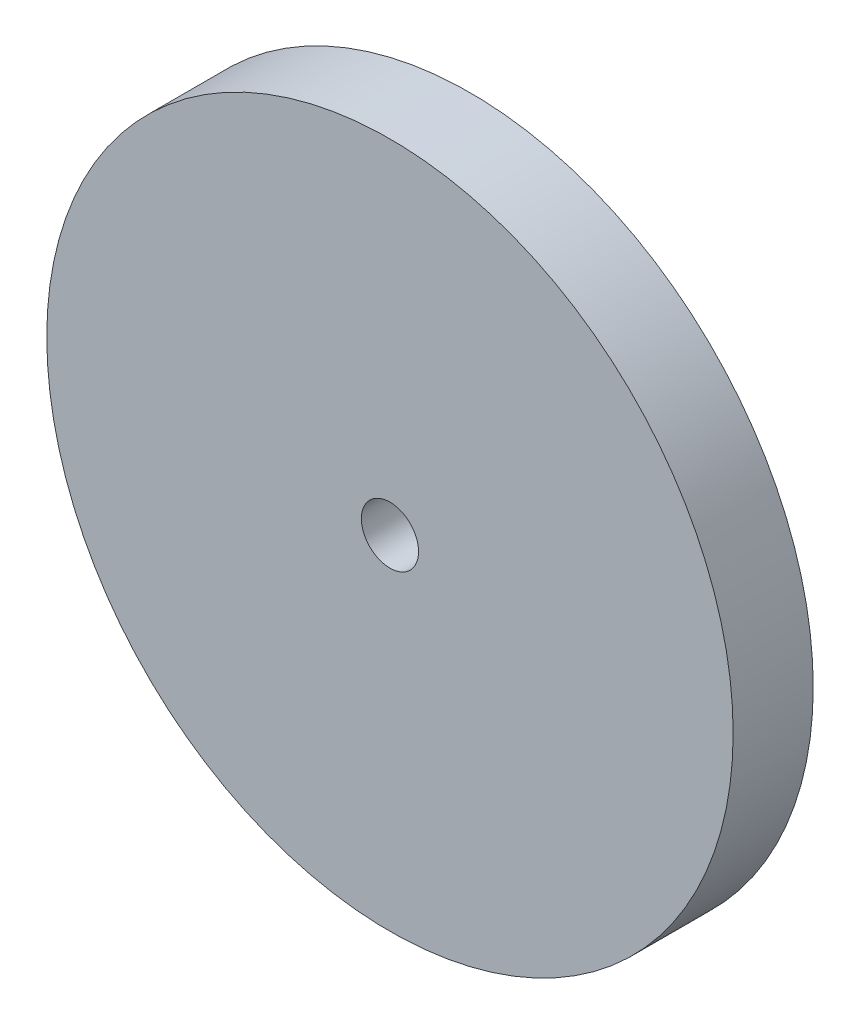
ISO-10303-21;
HEADER;
FILE_DESCRIPTION(('STEP AP214'),'2;1');
FILE_NAME('part.step','',(''),(''),'','','');
FILE_SCHEMA(('AUTOMOTIVE_DESIGN { 1 0 10303 214 1 1 1 1 }'));
ENDSEC;
DATA;
#1=APPLICATION_CONTEXT('core data for automotive mechanical design processes');
#2=APPLICATION_PROTOCOL_DEFINITION('international standard','automotive_design',2000,#1);
#3=PRODUCT_CONTEXT('',#1,'mechanical');
#4=PRODUCT('Part','Part','',(#3));
#5=PRODUCT_RELATED_PRODUCT_CATEGORY('part','',(#4));
#6=PRODUCT_DEFINITION_FORMATION('','',#4);
#7=PRODUCT_DEFINITION_CONTEXT('part definition',#1,'design');
#8=PRODUCT_DEFINITION('design','',#6,#7);
#9=PRODUCT_DEFINITION_SHAPE('','',#8);
#10=(LENGTH_UNIT() NAMED_UNIT(*) SI_UNIT(.MILLI.,.METRE.));
#11=(NAMED_UNIT(*) PLANE_ANGLE_UNIT() SI_UNIT($,.RADIAN.));
#12=(NAMED_UNIT(*) SI_UNIT($,.STERADIAN.) SOLID_ANGLE_UNIT());
#13=UNCERTAINTY_MEASURE_WITH_UNIT(LENGTH_MEASURE(1.E-05),#10,'distance_accuracy_value','');
#14=(GEOMETRIC_REPRESENTATION_CONTEXT(3) GLOBAL_UNCERTAINTY_ASSIGNED_CONTEXT((#13)) GLOBAL_UNIT_ASSIGNED_CONTEXT((#10,
#11,#12)) REPRESENTATION_CONTEXT('',''));
#15=CARTESIAN_POINT('',(0.,0.,0.));
#16=DIRECTION('',(0.,0.,1.));
#17=DIRECTION('',(1.,0.,0.));
#18=AXIS2_PLACEMENT_3D('',#15,#16,#17);
#19=CARTESIAN_POINT('',(0.,0.,-7.));
#20=DIRECTION('',(0.,0.,1.));
#21=DIRECTION('',(1.,0.,0.));
#22=AXIS2_PLACEMENT_3D('',#19,#20,#21);
#23=CYLINDRICAL_SURFACE('',#22,30.);
#24=CARTESIAN_POINT('',(0.,0.,-7.));
#25=DIRECTION('',(0.,0.,1.));
#26=DIRECTION('',(1.,0.,0.));
#27=AXIS2_PLACEMENT_3D('',#24,#25,#26);
#28=CIRCLE('',#27,30.);
#29=CARTESIAN_POINT('',(30.,0.,-7.));
#30=VERTEX_POINT('',#29);
#31=EDGE_CURVE('E10',#30,#30,#28,.T.);
#32=ORIENTED_EDGE('',*,*,#31,.T.);
#33=EDGE_LOOP('',(#32));
#34=FACE_BOUND('',#33,.T.);
#35=CARTESIAN_POINT('',(0.,0.,0.));
#36=DIRECTION('',(0.,0.,1.));
#37=DIRECTION('',(1.,0.,0.));
#38=AXIS2_PLACEMENT_3D('',#35,#36,#37);
#39=CIRCLE('',#38,30.);
#40=CARTESIAN_POINT('',(30.,0.,0.));
#41=VERTEX_POINT('',#40);
#42=EDGE_CURVE('E36',#41,#41,#39,.T.);
#43=ORIENTED_EDGE('',*,*,#42,.F.);
#44=EDGE_LOOP('',(#43));
#45=FACE_BOUND('',#44,.T.);
#46=ADVANCED_FACE('F33',(#34,#45),#23,.T.);
#47=CARTESIAN_POINT('',(0.,0.,-7.));
#48=DIRECTION('',(0.,0.,1.));
#49=DIRECTION('',(1.,0.,0.));
#50=AXIS2_PLACEMENT_3D('',#47,#48,#49);
#51=PLANE('',#50);
#52=CARTESIAN_POINT('',(0.,0.,-7.));
#53=DIRECTION('',(0.,0.,1.));
#54=DIRECTION('',(1.,0.,0.));
#55=AXIS2_PLACEMENT_3D('',#52,#53,#54);
#56=CIRCLE('',#55,2.5);
#57=CARTESIAN_POINT('',(2.5,0.,-7.));
#58=VERTEX_POINT('',#57);
#59=EDGE_CURVE('E43',#58,#58,#56,.T.);
#60=ORIENTED_EDGE('',*,*,#59,.T.);
#61=EDGE_LOOP('',(#60));
#62=FACE_BOUND('',#61,.T.);
#63=ORIENTED_EDGE('',*,*,#31,.F.);
#64=EDGE_LOOP('',(#63));
#65=FACE_BOUND('',#64,.T.);
#66=ADVANCED_FACE('F51',(#62,#65),#51,.F.);
#67=CARTESIAN_POINT('',(0.,0.,0.));
#68=DIRECTION('',(0.,0.,1.));
#69=DIRECTION('',(1.,0.,0.));
#70=AXIS2_PLACEMENT_3D('',#67,#68,#69);
#71=PLANE('',#70);
#72=CARTESIAN_POINT('',(0.,0.,0.));
#73=DIRECTION('',(0.,0.,1.));
#74=DIRECTION('',(1.,0.,0.));
#75=AXIS2_PLACEMENT_3D('',#72,#73,#74);
#76=CIRCLE('',#75,2.5);
#77=CARTESIAN_POINT('',(2.5,0.,0.));
#78=VERTEX_POINT('',#77);
#79=EDGE_CURVE('E45',#78,#78,#76,.T.);
#80=ORIENTED_EDGE('',*,*,#79,.F.);
#81=EDGE_LOOP('',(#80));
#82=FACE_BOUND('',#81,.T.);
#83=ORIENTED_EDGE('',*,*,#42,.T.);
#84=EDGE_LOOP('',(#83));
#85=FACE_BOUND('',#84,.T.);
#86=ADVANCED_FACE('F57',(#82,#85),#71,.T.);
#87=CARTESIAN_POINT('',(0.,0.,-7.));
#88=DIRECTION('',(0.,0.,1.));
#89=DIRECTION('',(1.,0.,0.));
#90=AXIS2_PLACEMENT_3D('',#87,#88,#89);
#91=CYLINDRICAL_SURFACE('',#90,2.5);
#92=ORIENTED_EDGE('',*,*,#59,.F.);
#93=EDGE_LOOP('',(#92));
#94=FACE_BOUND('',#93,.T.);
#95=ORIENTED_EDGE('',*,*,#79,.T.);
#96=EDGE_LOOP('',(#95));
#97=FACE_BOUND('',#96,.T.);
#98=ADVANCED_FACE('F54',(#94,#97),#91,.F.);
#99=CLOSED_SHELL('',(#46,#66,#86,#98));
#100=MANIFOLD_SOLID_BREP('B2',#99);
#101=ADVANCED_BREP_SHAPE_REPRESENTATION('',(#18,#100),#14);
#102=SHAPE_DEFINITION_REPRESENTATION(#9,#101);
ENDSEC;
END-ISO-10303-21;
